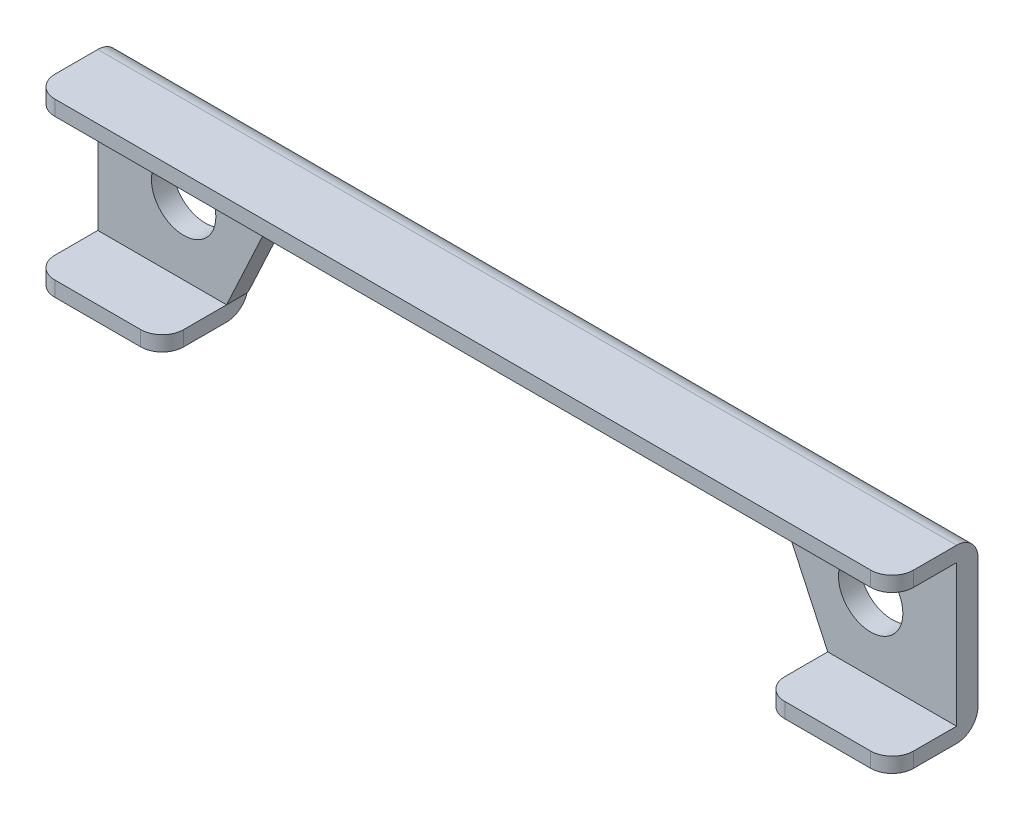
ISO-10303-21;
HEADER;
FILE_DESCRIPTION(('STEP AP214'),'2;1');
FILE_NAME('part.step','',(''),(''),'','','');
FILE_SCHEMA(('AUTOMOTIVE_DESIGN { 1 0 10303 214 1 1 1 1 }'));
ENDSEC;
DATA;
#1=APPLICATION_CONTEXT('core data for automotive mechanical design processes');
#2=APPLICATION_PROTOCOL_DEFINITION('international standard','automotive_design',2000,#1);
#3=PRODUCT_CONTEXT('',#1,'mechanical');
#4=PRODUCT('Part','Part','',(#3));
#5=PRODUCT_RELATED_PRODUCT_CATEGORY('part','',(#4));
#6=PRODUCT_DEFINITION_FORMATION('','',#4);
#7=PRODUCT_DEFINITION_CONTEXT('part definition',#1,'design');
#8=PRODUCT_DEFINITION('design','',#6,#7);
#9=PRODUCT_DEFINITION_SHAPE('','',#8);
#10=(LENGTH_UNIT() NAMED_UNIT(*) SI_UNIT(.MILLI.,.METRE.));
#11=(NAMED_UNIT(*) PLANE_ANGLE_UNIT() SI_UNIT($,.RADIAN.));
#12=(NAMED_UNIT(*) SI_UNIT($,.STERADIAN.) SOLID_ANGLE_UNIT());
#13=UNCERTAINTY_MEASURE_WITH_UNIT(LENGTH_MEASURE(1.E-05),#10,'distance_accuracy_value','');
#14=(GEOMETRIC_REPRESENTATION_CONTEXT(3) GLOBAL_UNCERTAINTY_ASSIGNED_CONTEXT((#13)) GLOBAL_UNIT_ASSIGNED_CONTEXT((#10,
#11,#12)) REPRESENTATION_CONTEXT('',''));
#15=CARTESIAN_POINT('',(0.,0.,0.));
#16=DIRECTION('',(0.,0.,1.));
#17=DIRECTION('',(1.,0.,0.));
#18=AXIS2_PLACEMENT_3D('',#15,#16,#17);
#19=CARTESIAN_POINT('',(-20.,-4.00000000000001,1.));
#20=DIRECTION('',(0.,1.,0.));
#21=DIRECTION('',(0.,0.,1.));
#22=AXIS2_PLACEMENT_3D('',#19,#20,#21);
#23=PLANE('',#22);
#24=DIRECTION('',(0.,0.,-1.));
#25=VECTOR('',#24,1.);
#26=CARTESIAN_POINT('',(20.,-4.,1.));
#27=LINE('',#26,#25);
#28=CARTESIAN_POINT('',(20.,-4.,3.));
#29=VERTEX_POINT('',#28);
#30=CARTESIAN_POINT('',(20.,-4.,1.));
#31=VERTEX_POINT('',#30);
#32=EDGE_CURVE('E269',#29,#31,#27,.T.);
#33=ORIENTED_EDGE('',*,*,#32,.F.);
#34=CARTESIAN_POINT('',(19.,-4.,3.));
#35=DIRECTION('',(0.,1.,0.));
#36=DIRECTION('',(0.,0.,1.));
#37=AXIS2_PLACEMENT_3D('',#34,#35,#36);
#38=CIRCLE('',#37,1.);
#39=CARTESIAN_POINT('',(19.,-4.,4.));
#40=VERTEX_POINT('',#39);
#41=EDGE_CURVE('E347',#29,#40,#38,.F.);
#42=ORIENTED_EDGE('',*,*,#41,.T.);
#43=DIRECTION('',(1.,0.,0.));
#44=VECTOR('',#43,1.);
#45=CARTESIAN_POINT('',(0.,-4.,4.));
#46=LINE('',#45,#44);
#47=CARTESIAN_POINT('',(15.,-4.00000000000001,4.));
#48=VERTEX_POINT('',#47);
#49=EDGE_CURVE('E407',#48,#40,#46,.T.);
#50=ORIENTED_EDGE('',*,*,#49,.F.);
#51=CARTESIAN_POINT('',(15.,-4.00000000000001,3.));
#52=DIRECTION('',(0.,1.,0.));
#53=DIRECTION('',(0.,0.,1.));
#54=AXIS2_PLACEMENT_3D('',#51,#52,#53);
#55=CIRCLE('',#54,1.);
#56=CARTESIAN_POINT('',(14.,-4.,3.));
#57=VERTEX_POINT('',#56);
#58=EDGE_CURVE('E345',#48,#57,#55,.F.);
#59=ORIENTED_EDGE('',*,*,#58,.T.);
#60=DIRECTION('',(0.,0.,-1.));
#61=VECTOR('',#60,1.);
#62=CARTESIAN_POINT('',(14.,-4.,4.));
#63=LINE('',#62,#61);
#64=CARTESIAN_POINT('',(14.,-4.,1.));
#65=VERTEX_POINT('',#64);
#66=EDGE_CURVE('E257',#57,#65,#63,.T.);
#67=ORIENTED_EDGE('',*,*,#66,.T.);
#68=DIRECTION('',(1.,0.,0.));
#69=VECTOR('',#68,1.);
#70=CARTESIAN_POINT('',(-20.,-4.00000000000001,1.));
#71=LINE('',#70,#69);
#72=EDGE_CURVE('E342',#65,#31,#71,.T.);
#73=ORIENTED_EDGE('',*,*,#72,.T.);
#74=EDGE_LOOP('',(#33,#42,#50,#59,#67,#73));
#75=FACE_BOUND('',#74,.T.);
#76=ADVANCED_FACE('F52',(#75),#23,.F.);
#77=CARTESIAN_POINT('',(0.,0.,1.));
#78=DIRECTION('',(0.,0.,1.));
#79=DIRECTION('',(1.,0.,0.));
#80=AXIS2_PLACEMENT_3D('',#77,#78,#79);
#81=PLANE('',#80);
#82=CARTESIAN_POINT('',(16.,0.,1.));
#83=DIRECTION('',(0.,0.,1.));
#84=DIRECTION('',(1.,0.,0.));
#85=AXIS2_PLACEMENT_3D('',#82,#83,#84);
#86=CIRCLE('',#85,1.5);
#87=CARTESIAN_POINT('',(17.5,0.,1.));
#88=VERTEX_POINT('',#87);
#89=EDGE_CURVE('E296',#88,#88,#86,.T.);
#90=ORIENTED_EDGE('',*,*,#89,.F.);
#91=EDGE_LOOP('',(#90));
#92=FACE_BOUND('',#91,.T.);
#93=CARTESIAN_POINT('',(-16.,0.,1.));
#94=DIRECTION('',(0.,0.,1.));
#95=DIRECTION('',(1.,0.,0.));
#96=AXIS2_PLACEMENT_3D('',#93,#94,#95);
#97=CIRCLE('',#96,1.5);
#98=CARTESIAN_POINT('',(-14.5,0.,1.));
#99=VERTEX_POINT('',#98);
#100=EDGE_CURVE('E443',#99,#99,#97,.T.);
#101=ORIENTED_EDGE('',*,*,#100,.F.);
#102=EDGE_LOOP('',(#101));
#103=FACE_BOUND('',#102,.T.);
#104=DIRECTION('',(-0.421730749715585,-0.906721111888507,0.));
#105=VECTOR('',#104,1.);
#106=CARTESIAN_POINT('',(-12.,1.,1.));
#107=LINE('',#106,#105);
#108=CARTESIAN_POINT('',(-12.,1.,1.));
#109=VERTEX_POINT('',#108);
#110=CARTESIAN_POINT('',(-14.,-3.30000000000004,1.));
#111=VERTEX_POINT('',#110);
#112=EDGE_CURVE('E235',#109,#111,#107,.T.);
#113=ORIENTED_EDGE('',*,*,#112,.F.);
#114=DIRECTION('',(-1.,0.,0.));
#115=VECTOR('',#114,1.);
#116=CARTESIAN_POINT('',(-12.,1.,1.));
#117=LINE('',#116,#115);
#118=CARTESIAN_POINT('',(12.,0.99999999999997,1.));
#119=VERTEX_POINT('',#118);
#120=EDGE_CURVE('E221',#119,#109,#117,.T.);
#121=ORIENTED_EDGE('',*,*,#120,.F.);
#122=DIRECTION('',(-0.421730749715584,0.906721111888507,0.));
#123=VECTOR('',#122,1.);
#124=CARTESIAN_POINT('',(14.,-3.3,1.));
#125=LINE('',#124,#123);
#126=CARTESIAN_POINT('',(14.,-3.3,1.));
#127=VERTEX_POINT('',#126);
#128=EDGE_CURVE('E242',#127,#119,#125,.T.);
#129=ORIENTED_EDGE('',*,*,#128,.F.);
#130=DIRECTION('',(1.,0.,0.));
#131=VECTOR('',#130,1.);
#132=CARTESIAN_POINT('',(0.,-3.3,1.));
#133=LINE('',#132,#131);
#134=CARTESIAN_POINT('',(20.,-3.30000000000001,1.));
#135=VERTEX_POINT('',#134);
#136=EDGE_CURVE('E417',#127,#135,#133,.T.);
#137=ORIENTED_EDGE('',*,*,#136,.T.);
#138=DIRECTION('',(0.,1.,0.));
#139=VECTOR('',#138,1.);
#140=CARTESIAN_POINT('',(20.,4.,1.));
#141=LINE('',#140,#139);
#142=CARTESIAN_POINT('',(20.,3.29999999999998,1.));
#143=VERTEX_POINT('',#142);
#144=EDGE_CURVE('E264',#135,#143,#141,.T.);
#145=ORIENTED_EDGE('',*,*,#144,.T.);
#146=DIRECTION('',(1.,0.,0.));
#147=VECTOR('',#146,1.);
#148=CARTESIAN_POINT('',(-20.,3.3,1.));
#149=LINE('',#148,#147);
#150=CARTESIAN_POINT('',(-20.,3.3,1.));
#151=VERTEX_POINT('',#150);
#152=EDGE_CURVE('E432',#151,#143,#149,.T.);
#153=ORIENTED_EDGE('',*,*,#152,.F.);
#154=DIRECTION('',(0.,-1.,0.));
#155=VECTOR('',#154,1.);
#156=CARTESIAN_POINT('',(-20.,4.,1.));
#157=LINE('',#156,#155);
#158=CARTESIAN_POINT('',(-20.,-3.3,1.));
#159=VERTEX_POINT('',#158);
#160=EDGE_CURVE('E249',#151,#159,#157,.T.);
#161=ORIENTED_EDGE('',*,*,#160,.T.);
#162=DIRECTION('',(-1.,0.,0.));
#163=VECTOR('',#162,1.);
#164=CARTESIAN_POINT('',(0.,-3.3,1.));
#165=LINE('',#164,#163);
#166=EDGE_CURVE('E229',#111,#159,#165,.T.);
#167=ORIENTED_EDGE('',*,*,#166,.F.);
#168=EDGE_LOOP('',(#113,#121,#129,#137,#145,#153,#161,#167));
#169=FACE_BOUND('',#168,.T.);
#170=ADVANCED_FACE('F246',(#92,#103,#169),#81,.T.);
#171=CARTESIAN_POINT('',(20.,4.,1.));
#172=DIRECTION('',(-1.,0.,0.));
#173=DIRECTION('',(0.,0.,1.));
#174=AXIS2_PLACEMENT_3D('',#171,#172,#173);
#175=PLANE('',#174);
#176=DIRECTION('',(0.,0.,-1.));
#177=VECTOR('',#176,1.);
#178=CARTESIAN_POINT('',(20.,-3.30000000000001,4.));
#179=LINE('',#178,#177);
#180=CARTESIAN_POINT('',(20.,-3.30000000000001,3.));
#181=VERTEX_POINT('',#180);
#182=EDGE_CURVE('E401',#181,#135,#179,.T.);
#183=ORIENTED_EDGE('',*,*,#182,.F.);
#184=DIRECTION('',(0.,1.,0.));
#185=VECTOR('',#184,1.);
#186=CARTESIAN_POINT('',(20.,-4.,3.));
#187=LINE('',#186,#185);
#188=EDGE_CURVE('E340',#181,#29,#187,.F.);
#189=ORIENTED_EDGE('',*,*,#188,.T.);
#190=ORIENTED_EDGE('',*,*,#32,.T.);
#191=CARTESIAN_POINT('',(20.,-3.00000000000002,1.));
#192=DIRECTION('',(-1.,0.,0.));
#193=DIRECTION('',(0.,0.,1.));
#194=AXIS2_PLACEMENT_3D('',#191,#192,#193);
#195=CIRCLE('',#194,1.);
#196=CARTESIAN_POINT('',(20.,-3.00000000000002,0.));
#197=VERTEX_POINT('',#196);
#198=EDGE_CURVE('E336',#31,#197,#195,.F.);
#199=ORIENTED_EDGE('',*,*,#198,.T.);
#200=DIRECTION('',(0.,1.,0.));
#201=VECTOR('',#200,1.);
#202=CARTESIAN_POINT('',(20.,4.,0.));
#203=LINE('',#202,#201);
#204=CARTESIAN_POINT('',(20.,2.99999999999999,0.));
#205=VERTEX_POINT('',#204);
#206=EDGE_CURVE('E231',#197,#205,#203,.T.);
#207=ORIENTED_EDGE('',*,*,#206,.T.);
#208=CARTESIAN_POINT('',(20.,2.99999999999999,1.));
#209=DIRECTION('',(-1.,0.,0.));
#210=DIRECTION('',(0.,0.,1.));
#211=AXIS2_PLACEMENT_3D('',#208,#209,#210);
#212=CIRCLE('',#211,1.);
#213=CARTESIAN_POINT('',(20.,4.,1.));
#214=VERTEX_POINT('',#213);
#215=EDGE_CURVE('E334',#205,#214,#212,.F.);
#216=ORIENTED_EDGE('',*,*,#215,.T.);
#217=DIRECTION('',(0.,0.,-1.));
#218=VECTOR('',#217,1.);
#219=CARTESIAN_POINT('',(20.,4.,1.));
#220=LINE('',#219,#218);
#221=CARTESIAN_POINT('',(20.,4.,3.));
#222=VERTEX_POINT('',#221);
#223=EDGE_CURVE('E282',#222,#214,#220,.T.);
#224=ORIENTED_EDGE('',*,*,#223,.F.);
#225=DIRECTION('',(0.,1.,0.));
#226=VECTOR('',#225,1.);
#227=CARTESIAN_POINT('',(20.,3.29999999999998,3.));
#228=LINE('',#227,#226);
#229=CARTESIAN_POINT('',(20.,3.29999999999998,3.));
#230=VERTEX_POINT('',#229);
#231=EDGE_CURVE('E338',#222,#230,#228,.F.);
#232=ORIENTED_EDGE('',*,*,#231,.T.);
#233=DIRECTION('',(0.,0.,-1.));
#234=VECTOR('',#233,1.);
#235=CARTESIAN_POINT('',(20.,3.29999999999998,4.));
#236=LINE('',#235,#234);
#237=EDGE_CURVE('E425',#230,#143,#236,.T.);
#238=ORIENTED_EDGE('',*,*,#237,.T.);
#239=ORIENTED_EDGE('',*,*,#144,.F.);
#240=EDGE_LOOP('',(#183,#189,#190,#199,#207,#216,#224,#232,#238,#239));
#241=FACE_BOUND('',#240,.T.);
#242=ADVANCED_FACE('F398',(#241),#175,.F.);
#243=CARTESIAN_POINT('',(-20.,4.,1.));
#244=DIRECTION('',(0.,-1.,0.));
#245=DIRECTION('',(0.,0.,-1.));
#246=AXIS2_PLACEMENT_3D('',#243,#244,#245);
#247=PLANE('',#246);
#248=DIRECTION('',(-1.,0.,0.));
#249=VECTOR('',#248,1.);
#250=CARTESIAN_POINT('',(-20.,4.,4.));
#251=LINE('',#250,#249);
#252=CARTESIAN_POINT('',(19.,4.,4.));
#253=VERTEX_POINT('',#252);
#254=CARTESIAN_POINT('',(-19.,3.99999999999999,4.));
#255=VERTEX_POINT('',#254);
#256=EDGE_CURVE('E429',#253,#255,#251,.T.);
#257=ORIENTED_EDGE('',*,*,#256,.F.);
#258=CARTESIAN_POINT('',(19.,4.,3.));
#259=DIRECTION('',(0.,-1.,0.));
#260=DIRECTION('',(0.,0.,-1.));
#261=AXIS2_PLACEMENT_3D('',#258,#259,#260);
#262=CIRCLE('',#261,1.);
#263=EDGE_CURVE('E365',#253,#222,#262,.F.);
#264=ORIENTED_EDGE('',*,*,#263,.T.);
#265=ORIENTED_EDGE('',*,*,#223,.T.);
#266=DIRECTION('',(-1.,0.,0.));
#267=VECTOR('',#266,1.);
#268=CARTESIAN_POINT('',(-20.,4.,1.));
#269=LINE('',#268,#267);
#270=CARTESIAN_POINT('',(-20.,4.,1.));
#271=VERTEX_POINT('',#270);
#272=EDGE_CURVE('E360',#214,#271,#269,.T.);
#273=ORIENTED_EDGE('',*,*,#272,.T.);
#274=DIRECTION('',(0.,0.,-1.));
#275=VECTOR('',#274,1.);
#276=CARTESIAN_POINT('',(-20.,4.,1.));
#277=LINE('',#276,#275);
#278=CARTESIAN_POINT('',(-20.,4.,3.));
#279=VERTEX_POINT('',#278);
#280=EDGE_CURVE('E279',#279,#271,#277,.T.);
#281=ORIENTED_EDGE('',*,*,#280,.F.);
#282=CARTESIAN_POINT('',(-19.,3.99999999999999,3.));
#283=DIRECTION('',(0.,-1.,0.));
#284=DIRECTION('',(0.,0.,-1.));
#285=AXIS2_PLACEMENT_3D('',#282,#283,#284);
#286=CIRCLE('',#285,1.);
#287=EDGE_CURVE('E363',#279,#255,#286,.F.);
#288=ORIENTED_EDGE('',*,*,#287,.T.);
#289=EDGE_LOOP('',(#257,#264,#265,#273,#281,#288));
#290=FACE_BOUND('',#289,.T.);
#291=ADVANCED_FACE('F477',(#290),#247,.F.);
#292=CARTESIAN_POINT('',(-20.,4.,1.));
#293=DIRECTION('',(1.,0.,0.));
#294=DIRECTION('',(0.,0.,-1.));
#295=AXIS2_PLACEMENT_3D('',#292,#293,#294);
#296=PLANE('',#295);
#297=DIRECTION('',(0.,0.,-1.));
#298=VECTOR('',#297,1.);
#299=CARTESIAN_POINT('',(-20.,-4.00000000000001,1.));
#300=LINE('',#299,#298);
#301=CARTESIAN_POINT('',(-20.,-4.00000000000001,3.));
#302=VERTEX_POINT('',#301);
#303=CARTESIAN_POINT('',(-20.,-4.00000000000001,1.));
#304=VERTEX_POINT('',#303);
#305=EDGE_CURVE('E276',#302,#304,#300,.T.);
#306=ORIENTED_EDGE('',*,*,#305,.F.);
#307=DIRECTION('',(0.,-1.,0.));
#308=VECTOR('',#307,1.);
#309=CARTESIAN_POINT('',(-20.,-3.3,3.));
#310=LINE('',#309,#308);
#311=CARTESIAN_POINT('',(-20.,-3.3,3.));
#312=VERTEX_POINT('',#311);
#313=EDGE_CURVE('E323',#302,#312,#310,.F.);
#314=ORIENTED_EDGE('',*,*,#313,.T.);
#315=DIRECTION('',(0.,0.,-1.));
#316=VECTOR('',#315,1.);
#317=CARTESIAN_POINT('',(-20.,-3.3,4.));
#318=LINE('',#317,#316);
#319=EDGE_CURVE('E232',#312,#159,#318,.T.);
#320=ORIENTED_EDGE('',*,*,#319,.T.);
#321=ORIENTED_EDGE('',*,*,#160,.F.);
#322=DIRECTION('',(0.,0.,-1.));
#323=VECTOR('',#322,1.);
#324=CARTESIAN_POINT('',(-20.,3.3,4.));
#325=LINE('',#324,#323);
#326=CARTESIAN_POINT('',(-20.,3.3,3.));
#327=VERTEX_POINT('',#326);
#328=EDGE_CURVE('E422',#327,#151,#325,.T.);
#329=ORIENTED_EDGE('',*,*,#328,.F.);
#330=DIRECTION('',(0.,-1.,0.));
#331=VECTOR('',#330,1.);
#332=CARTESIAN_POINT('',(-20.,4.,3.));
#333=LINE('',#332,#331);
#334=EDGE_CURVE('E321',#327,#279,#333,.F.);
#335=ORIENTED_EDGE('',*,*,#334,.T.);
#336=ORIENTED_EDGE('',*,*,#280,.T.);
#337=CARTESIAN_POINT('',(-20.,3.,1.));
#338=DIRECTION('',(1.,0.,0.));
#339=DIRECTION('',(0.,0.,-1.));
#340=AXIS2_PLACEMENT_3D('',#337,#338,#339);
#341=CIRCLE('',#340,1.);
#342=CARTESIAN_POINT('',(-20.,3.,0.));
#343=VERTEX_POINT('',#342);
#344=EDGE_CURVE('E317',#271,#343,#341,.F.);
#345=ORIENTED_EDGE('',*,*,#344,.T.);
#346=DIRECTION('',(0.,-1.,0.));
#347=VECTOR('',#346,1.);
#348=CARTESIAN_POINT('',(-20.,4.,0.));
#349=LINE('',#348,#347);
#350=CARTESIAN_POINT('',(-20.,-3.,0.));
#351=VERTEX_POINT('',#350);
#352=EDGE_CURVE('E267',#343,#351,#349,.T.);
#353=ORIENTED_EDGE('',*,*,#352,.T.);
#354=CARTESIAN_POINT('',(-20.,-3.,1.));
#355=DIRECTION('',(1.,0.,0.));
#356=DIRECTION('',(0.,0.,-1.));
#357=AXIS2_PLACEMENT_3D('',#354,#355,#356);
#358=CIRCLE('',#357,1.);
#359=EDGE_CURVE('E319',#351,#304,#358,.F.);
#360=ORIENTED_EDGE('',*,*,#359,.T.);
#361=EDGE_LOOP('',(#306,#314,#320,#321,#329,#335,#336,#345,#353,#360));
#362=FACE_BOUND('',#361,.T.);
#363=ADVANCED_FACE('F481',(#362),#296,.F.);
#364=DIRECTION('',(0.,0.,-1.));
#365=VECTOR('',#364,1.);
#366=CARTESIAN_POINT('',(-14.,-4.00000000000003,4.));
#367=LINE('',#366,#365);
#368=CARTESIAN_POINT('',(-14.,-4.00000000000003,3.));
#369=VERTEX_POINT('',#368);
#370=CARTESIAN_POINT('',(-14.,-4.00000000000003,1.));
#371=VERTEX_POINT('',#370);
#372=EDGE_CURVE('E261',#369,#371,#367,.T.);
#373=ORIENTED_EDGE('',*,*,#372,.F.);
#374=CARTESIAN_POINT('',(-15.,-4.,3.));
#375=DIRECTION('',(0.,1.,0.));
#376=DIRECTION('',(0.,0.,1.));
#377=AXIS2_PLACEMENT_3D('',#374,#375,#376);
#378=CIRCLE('',#377,1.);
#379=CARTESIAN_POINT('',(-15.,-4.,4.));
#380=VERTEX_POINT('',#379);
#381=EDGE_CURVE('E315',#369,#380,#378,.F.);
#382=ORIENTED_EDGE('',*,*,#381,.T.);
#383=DIRECTION('',(1.,0.,0.));
#384=VECTOR('',#383,1.);
#385=CARTESIAN_POINT('',(0.,-4.,4.));
#386=LINE('',#385,#384);
#387=CARTESIAN_POINT('',(-19.,-4.00000000000002,4.));
#388=VERTEX_POINT('',#387);
#389=EDGE_CURVE('E254',#388,#380,#386,.T.);
#390=ORIENTED_EDGE('',*,*,#389,.F.);
#391=CARTESIAN_POINT('',(-19.,-4.00000000000002,3.));
#392=DIRECTION('',(0.,1.,0.));
#393=DIRECTION('',(0.,0.,1.));
#394=AXIS2_PLACEMENT_3D('',#391,#392,#393);
#395=CIRCLE('',#394,1.);
#396=EDGE_CURVE('E313',#388,#302,#395,.F.);
#397=ORIENTED_EDGE('',*,*,#396,.T.);
#398=ORIENTED_EDGE('',*,*,#305,.T.);
#399=DIRECTION('',(1.,0.,0.));
#400=VECTOR('',#399,1.);
#401=CARTESIAN_POINT('',(-20.,-4.00000000000001,1.));
#402=LINE('',#401,#400);
#403=EDGE_CURVE('E310',#304,#371,#402,.T.);
#404=ORIENTED_EDGE('',*,*,#403,.T.);
#405=EDGE_LOOP('',(#373,#382,#390,#397,#398,#404));
#406=FACE_BOUND('',#405,.T.);
#407=ADVANCED_FACE('F465',(#406),#23,.F.);
#408=CARTESIAN_POINT('',(0.,0.,0.));
#409=DIRECTION('',(0.,0.,1.));
#410=DIRECTION('',(1.,0.,0.));
#411=AXIS2_PLACEMENT_3D('',#408,#409,#410);
#412=PLANE('',#411);
#413=CARTESIAN_POINT('',(16.,0.,0.));
#414=DIRECTION('',(0.,0.,1.));
#415=DIRECTION('',(1.,0.,0.));
#416=AXIS2_PLACEMENT_3D('',#413,#414,#415);
#417=CIRCLE('',#416,1.5);
#418=CARTESIAN_POINT('',(17.5,0.,0.));
#419=VERTEX_POINT('',#418);
#420=EDGE_CURVE('E243',#419,#419,#417,.T.);
#421=ORIENTED_EDGE('',*,*,#420,.T.);
#422=EDGE_LOOP('',(#421));
#423=FACE_BOUND('',#422,.T.);
#424=CARTESIAN_POINT('',(-16.,0.,0.));
#425=DIRECTION('',(0.,0.,1.));
#426=DIRECTION('',(1.,0.,0.));
#427=AXIS2_PLACEMENT_3D('',#424,#425,#426);
#428=CIRCLE('',#427,1.5);
#429=CARTESIAN_POINT('',(-14.5,0.,0.));
#430=VERTEX_POINT('',#429);
#431=EDGE_CURVE('E293',#430,#430,#428,.T.);
#432=ORIENTED_EDGE('',*,*,#431,.T.);
#433=EDGE_LOOP('',(#432));
#434=FACE_BOUND('',#433,.T.);
#435=ORIENTED_EDGE('',*,*,#206,.F.);
#436=DIRECTION('',(1.,0.,0.));
#437=VECTOR('',#436,1.);
#438=CARTESIAN_POINT('',(0.,-3.,0.));
#439=LINE('',#438,#437);
#440=CARTESIAN_POINT('',(13.8604651162791,-3.,0.));
#441=VERTEX_POINT('',#440);
#442=EDGE_CURVE('E73',#197,#441,#439,.F.);
#443=ORIENTED_EDGE('',*,*,#442,.T.);
#444=DIRECTION('',(-0.421730749715584,0.906721111888507,0.));
#445=VECTOR('',#444,1.);
#446=CARTESIAN_POINT('',(10.2481102712316,4.76656291685193,0.));
#447=LINE('',#446,#445);
#448=CARTESIAN_POINT('',(12.,0.99999999999997,0.));
#449=VERTEX_POINT('',#448);
#450=EDGE_CURVE('E290',#441,#449,#447,.T.);
#451=ORIENTED_EDGE('',*,*,#450,.T.);
#452=DIRECTION('',(-1.,0.,0.));
#453=VECTOR('',#452,1.);
#454=CARTESIAN_POINT('',(0.,1.,0.));
#455=LINE('',#454,#453);
#456=CARTESIAN_POINT('',(-12.,1.,0.));
#457=VERTEX_POINT('',#456);
#458=EDGE_CURVE('E287',#449,#457,#455,.T.);
#459=ORIENTED_EDGE('',*,*,#458,.T.);
#460=DIRECTION('',(-0.421730749715585,-0.906721111888507,0.));
#461=VECTOR('',#460,1.);
#462=CARTESIAN_POINT('',(-10.2481102712317,4.76656291685193,0.));
#463=LINE('',#462,#461);
#464=CARTESIAN_POINT('',(-13.8604651162791,-3.00000000000009,0.));
#465=VERTEX_POINT('',#464);
#466=EDGE_CURVE('E285',#457,#465,#463,.T.);
#467=ORIENTED_EDGE('',*,*,#466,.T.);
#468=DIRECTION('',(1.,0.,0.));
#469=VECTOR('',#468,1.);
#470=CARTESIAN_POINT('',(0.,-3.,0.));
#471=LINE('',#470,#469);
#472=EDGE_CURVE('E373',#465,#351,#471,.F.);
#473=ORIENTED_EDGE('',*,*,#472,.T.);
#474=ORIENTED_EDGE('',*,*,#352,.F.);
#475=DIRECTION('',(-1.,0.,0.));
#476=VECTOR('',#475,1.);
#477=CARTESIAN_POINT('',(0.,3.,0.));
#478=LINE('',#477,#476);
#479=EDGE_CURVE('E371',#343,#205,#478,.F.);
#480=ORIENTED_EDGE('',*,*,#479,.T.);
#481=EDGE_LOOP('',(#435,#443,#451,#459,#467,#473,#474,#480));
#482=FACE_BOUND('',#481,.T.);
#483=ADVANCED_FACE('F463',(#423,#434,#482),#412,.F.);
#484=CARTESIAN_POINT('',(-14.,0.,4.));
#485=DIRECTION('',(-1.,0.,0.));
#486=DIRECTION('',(0.,0.,1.));
#487=AXIS2_PLACEMENT_3D('',#484,#485,#486);
#488=PLANE('',#487);
#489=DIRECTION('',(0.,0.,-1.));
#490=VECTOR('',#489,1.);
#491=CARTESIAN_POINT('',(-14.,-3.30000000000004,4.));
#492=LINE('',#491,#490);
#493=CARTESIAN_POINT('',(-14.,-3.30000000000004,3.));
#494=VERTEX_POINT('',#493);
#495=EDGE_CURVE('E215',#494,#111,#492,.T.);
#496=ORIENTED_EDGE('',*,*,#495,.F.);
#497=DIRECTION('',(0.,1.,0.));
#498=VECTOR('',#497,1.);
#499=CARTESIAN_POINT('',(-14.,-4.00000000000003,3.));
#500=LINE('',#499,#498);
#501=EDGE_CURVE('E308',#494,#369,#500,.F.);
#502=ORIENTED_EDGE('',*,*,#501,.T.);
#503=ORIENTED_EDGE('',*,*,#372,.T.);
#504=CARTESIAN_POINT('',(-14.,-3.00000000000003,1.));
#505=DIRECTION('',(-1.,0.,0.));
#506=DIRECTION('',(0.,0.,1.));
#507=AXIS2_PLACEMENT_3D('',#504,#505,#506);
#508=CIRCLE('',#507,1.);
#509=CARTESIAN_POINT('',(-14.,-3.30000000000004,0.0460607985830544));
#510=VERTEX_POINT('',#509);
#511=EDGE_CURVE('E218',#371,#510,#508,.F.);
#512=ORIENTED_EDGE('',*,*,#511,.T.);
#513=DIRECTION('',(0.,0.,1.));
#514=VECTOR('',#513,1.);
#515=CARTESIAN_POINT('',(-14.,-3.30000000000004,-2.));
#516=LINE('',#515,#514);
#517=EDGE_CURVE('E212',#510,#111,#516,.T.);
#518=ORIENTED_EDGE('',*,*,#517,.T.);
#519=EDGE_LOOP('',(#496,#502,#503,#512,#518));
#520=FACE_BOUND('',#519,.T.);
#521=ADVANCED_FACE('F214',(#520),#488,.F.);
#522=CARTESIAN_POINT('',(0.,-3.3,4.));
#523=DIRECTION('',(0.,-1.,0.));
#524=DIRECTION('',(0.,0.,-1.));
#525=AXIS2_PLACEMENT_3D('',#522,#523,#524);
#526=PLANE('',#525);
#527=DIRECTION('',(-1.,0.,0.));
#528=VECTOR('',#527,1.);
#529=CARTESIAN_POINT('',(0.,-3.3,4.));
#530=LINE('',#529,#528);
#531=CARTESIAN_POINT('',(-15.,-3.30000000000001,4.));
#532=VERTEX_POINT('',#531);
#533=CARTESIAN_POINT('',(-19.,-3.30000000000001,4.));
#534=VERTEX_POINT('',#533);
#535=EDGE_CURVE('E250',#532,#534,#530,.T.);
#536=ORIENTED_EDGE('',*,*,#535,.F.);
#537=CARTESIAN_POINT('',(-15.,-3.30000000000001,3.));
#538=DIRECTION('',(0.,-1.,0.));
#539=DIRECTION('',(0.,0.,-1.));
#540=AXIS2_PLACEMENT_3D('',#537,#538,#539);
#541=CIRCLE('',#540,1.);
#542=EDGE_CURVE('E230',#532,#494,#541,.F.);
#543=ORIENTED_EDGE('',*,*,#542,.T.);
#544=ORIENTED_EDGE('',*,*,#495,.T.);
#545=ORIENTED_EDGE('',*,*,#166,.T.);
#546=ORIENTED_EDGE('',*,*,#319,.F.);
#547=CARTESIAN_POINT('',(-19.,-3.30000000000001,3.));
#548=DIRECTION('',(0.,-1.,0.));
#549=DIRECTION('',(0.,0.,-1.));
#550=AXIS2_PLACEMENT_3D('',#547,#548,#549);
#551=CIRCLE('',#550,1.);
#552=EDGE_CURVE('E304',#312,#534,#551,.F.);
#553=ORIENTED_EDGE('',*,*,#552,.T.);
#554=EDGE_LOOP('',(#536,#543,#544,#545,#546,#553));
#555=FACE_BOUND('',#554,.T.);
#556=ADVANCED_FACE('F226',(#555),#526,.F.);
#557=CARTESIAN_POINT('',(0.,0.,4.));
#558=DIRECTION('',(0.,0.,1.));
#559=DIRECTION('',(1.,0.,0.));
#560=AXIS2_PLACEMENT_3D('',#557,#558,#559);
#561=PLANE('',#560);
#562=ORIENTED_EDGE('',*,*,#389,.T.);
#563=DIRECTION('',(0.,1.,0.));
#564=VECTOR('',#563,1.);
#565=CARTESIAN_POINT('',(-15.,-3.30000000000001,4.));
#566=LINE('',#565,#564);
#567=EDGE_CURVE('E301',#380,#532,#566,.T.);
#568=ORIENTED_EDGE('',*,*,#567,.T.);
#569=ORIENTED_EDGE('',*,*,#535,.T.);
#570=DIRECTION('',(0.,-1.,0.));
#571=VECTOR('',#570,1.);
#572=CARTESIAN_POINT('',(-19.,-4.00000000000002,4.));
#573=LINE('',#572,#571);
#574=EDGE_CURVE('E292',#534,#388,#573,.T.);
#575=ORIENTED_EDGE('',*,*,#574,.T.);
#576=EDGE_LOOP('',(#562,#568,#569,#575));
#577=FACE_BOUND('',#576,.T.);
#578=ADVANCED_FACE('F504',(#577),#561,.T.);
#579=CARTESIAN_POINT('',(0.,-3.3,4.));
#580=DIRECTION('',(0.,1.,0.));
#581=DIRECTION('',(-1.,0.,0.));
#582=AXIS2_PLACEMENT_3D('',#579,#580,#581);
#583=PLANE('',#582);
#584=DIRECTION('',(1.,0.,0.));
#585=VECTOR('',#584,1.);
#586=CARTESIAN_POINT('',(0.,-3.3,4.));
#587=LINE('',#586,#585);
#588=CARTESIAN_POINT('',(15.,-3.3,4.));
#589=VERTEX_POINT('',#588);
#590=CARTESIAN_POINT('',(19.,-3.3,4.));
#591=VERTEX_POINT('',#590);
#592=EDGE_CURVE('E414',#589,#591,#587,.T.);
#593=ORIENTED_EDGE('',*,*,#592,.T.);
#594=CARTESIAN_POINT('',(19.,-3.3,3.));
#595=DIRECTION('',(0.,1.,0.));
#596=DIRECTION('',(-1.,0.,0.));
#597=AXIS2_PLACEMENT_3D('',#594,#595,#596);
#598=CIRCLE('',#597,1.);
#599=EDGE_CURVE('E332',#591,#181,#598,.T.);
#600=ORIENTED_EDGE('',*,*,#599,.T.);
#601=ORIENTED_EDGE('',*,*,#182,.T.);
#602=ORIENTED_EDGE('',*,*,#136,.F.);
#603=DIRECTION('',(0.,0.,-1.));
#604=VECTOR('',#603,1.);
#605=CARTESIAN_POINT('',(14.,-3.3,4.));
#606=LINE('',#605,#604);
#607=CARTESIAN_POINT('',(14.,-3.3,3.));
#608=VERTEX_POINT('',#607);
#609=EDGE_CURVE('E251',#608,#127,#606,.T.);
#610=ORIENTED_EDGE('',*,*,#609,.F.);
#611=CARTESIAN_POINT('',(15.,-3.3,3.));
#612=DIRECTION('',(0.,1.,0.));
#613=DIRECTION('',(-1.,0.,0.));
#614=AXIS2_PLACEMENT_3D('',#611,#612,#613);
#615=CIRCLE('',#614,1.);
#616=EDGE_CURVE('E330',#608,#589,#615,.T.);
#617=ORIENTED_EDGE('',*,*,#616,.T.);
#618=EDGE_LOOP('',(#593,#600,#601,#602,#610,#617));
#619=FACE_BOUND('',#618,.T.);
#620=ADVANCED_FACE('F561',(#619),#583,.T.);
#621=CARTESIAN_POINT('',(14.,0.,4.));
#622=DIRECTION('',(-1.,0.,0.));
#623=DIRECTION('',(0.,-1.,0.));
#624=AXIS2_PLACEMENT_3D('',#621,#622,#623);
#625=PLANE('',#624);
#626=ORIENTED_EDGE('',*,*,#66,.F.);
#627=DIRECTION('',(0.,1.,0.));
#628=VECTOR('',#627,1.);
#629=CARTESIAN_POINT('',(14.,0.,3.));
#630=LINE('',#629,#628);
#631=EDGE_CURVE('E351',#57,#608,#630,.T.);
#632=ORIENTED_EDGE('',*,*,#631,.T.);
#633=ORIENTED_EDGE('',*,*,#609,.T.);
#634=DIRECTION('',(0.,0.,1.));
#635=VECTOR('',#634,1.);
#636=CARTESIAN_POINT('',(14.,-3.3,-2.));
#637=LINE('',#636,#635);
#638=CARTESIAN_POINT('',(14.,-3.3,0.0460607985830544));
#639=VERTEX_POINT('',#638);
#640=EDGE_CURVE('E220',#639,#127,#637,.T.);
#641=ORIENTED_EDGE('',*,*,#640,.F.);
#642=CARTESIAN_POINT('',(14.,-3.,1.));
#643=DIRECTION('',(-1.,0.,0.));
#644=DIRECTION('',(0.,-1.,0.));
#645=AXIS2_PLACEMENT_3D('',#642,#643,#644);
#646=CIRCLE('',#645,1.);
#647=EDGE_CURVE('E349',#639,#65,#646,.T.);
#648=ORIENTED_EDGE('',*,*,#647,.T.);
#649=EDGE_LOOP('',(#626,#632,#633,#641,#648));
#650=FACE_BOUND('',#649,.T.);
#651=ADVANCED_FACE('F385',(#650),#625,.T.);
#652=CARTESIAN_POINT('',(0.,0.,4.));
#653=DIRECTION('',(0.,0.,1.));
#654=DIRECTION('',(1.,0.,0.));
#655=AXIS2_PLACEMENT_3D('',#652,#653,#654);
#656=PLANE('',#655);
#657=ORIENTED_EDGE('',*,*,#49,.T.);
#658=DIRECTION('',(0.,1.,0.));
#659=VECTOR('',#658,1.);
#660=CARTESIAN_POINT('',(19.,-3.3,4.));
#661=LINE('',#660,#659);
#662=EDGE_CURVE('E327',#40,#591,#661,.T.);
#663=ORIENTED_EDGE('',*,*,#662,.T.);
#664=ORIENTED_EDGE('',*,*,#592,.F.);
#665=DIRECTION('',(0.,1.,0.));
#666=VECTOR('',#665,1.);
#667=CARTESIAN_POINT('',(15.,0.,4.));
#668=LINE('',#667,#666);
#669=EDGE_CURVE('E325',#589,#48,#668,.F.);
#670=ORIENTED_EDGE('',*,*,#669,.T.);
#671=EDGE_LOOP('',(#657,#663,#664,#670));
#672=FACE_BOUND('',#671,.T.);
#673=ADVANCED_FACE('F410',(#672),#656,.T.);
#674=CARTESIAN_POINT('',(-20.,3.3,4.));
#675=DIRECTION('',(0.,1.,0.));
#676=DIRECTION('',(0.,0.,1.));
#677=AXIS2_PLACEMENT_3D('',#674,#675,#676);
#678=PLANE('',#677);
#679=ORIENTED_EDGE('',*,*,#237,.F.);
#680=CARTESIAN_POINT('',(19.,3.3,3.));
#681=DIRECTION('',(0.,1.,0.));
#682=DIRECTION('',(0.,0.,1.));
#683=AXIS2_PLACEMENT_3D('',#680,#681,#682);
#684=CIRCLE('',#683,1.);
#685=CARTESIAN_POINT('',(19.,3.3,4.));
#686=VERTEX_POINT('',#685);
#687=EDGE_CURVE('E369',#230,#686,#684,.F.);
#688=ORIENTED_EDGE('',*,*,#687,.T.);
#689=DIRECTION('',(1.,0.,0.));
#690=VECTOR('',#689,1.);
#691=CARTESIAN_POINT('',(-20.,3.3,4.));
#692=LINE('',#691,#690);
#693=CARTESIAN_POINT('',(-19.,3.29999999999998,4.));
#694=VERTEX_POINT('',#693);
#695=EDGE_CURVE('E434',#694,#686,#692,.T.);
#696=ORIENTED_EDGE('',*,*,#695,.F.);
#697=CARTESIAN_POINT('',(-19.,3.29999999999998,3.));
#698=DIRECTION('',(0.,1.,0.));
#699=DIRECTION('',(0.,0.,1.));
#700=AXIS2_PLACEMENT_3D('',#697,#698,#699);
#701=CIRCLE('',#700,1.);
#702=EDGE_CURVE('E367',#694,#327,#701,.F.);
#703=ORIENTED_EDGE('',*,*,#702,.T.);
#704=ORIENTED_EDGE('',*,*,#328,.T.);
#705=ORIENTED_EDGE('',*,*,#152,.T.);
#706=EDGE_LOOP('',(#679,#688,#696,#703,#704,#705));
#707=FACE_BOUND('',#706,.T.);
#708=ADVANCED_FACE('F495',(#707),#678,.F.);
#709=CARTESIAN_POINT('',(0.,0.,4.));
#710=DIRECTION('',(0.,0.,1.));
#711=DIRECTION('',(1.,0.,0.));
#712=AXIS2_PLACEMENT_3D('',#709,#710,#711);
#713=PLANE('',#712);
#714=ORIENTED_EDGE('',*,*,#695,.T.);
#715=DIRECTION('',(0.,1.,0.));
#716=VECTOR('',#715,1.);
#717=CARTESIAN_POINT('',(19.,4.,4.));
#718=LINE('',#717,#716);
#719=EDGE_CURVE('E357',#686,#253,#718,.T.);
#720=ORIENTED_EDGE('',*,*,#719,.T.);
#721=ORIENTED_EDGE('',*,*,#256,.T.);
#722=DIRECTION('',(0.,-1.,0.));
#723=VECTOR('',#722,1.);
#724=CARTESIAN_POINT('',(-19.,3.29999999999998,4.));
#725=LINE('',#724,#723);
#726=EDGE_CURVE('E354',#255,#694,#725,.T.);
#727=ORIENTED_EDGE('',*,*,#726,.T.);
#728=EDGE_LOOP('',(#714,#720,#721,#727));
#729=FACE_BOUND('',#728,.T.);
#730=ADVANCED_FACE('F487',(#729),#713,.T.);
#731=CARTESIAN_POINT('',(-12.,1.,-2.));
#732=DIRECTION('',(-0.906721111888507,0.421730749715585,0.));
#733=DIRECTION('',(-0.421730749715585,-0.906721111888507,0.));
#734=AXIS2_PLACEMENT_3D('',#731,#732,#733);
#735=PLANE('',#734);
#736=ORIENTED_EDGE('',*,*,#517,.F.);
#737=CARTESIAN_POINT('',(-13.8604651162791,-3.00000000000009,1.));
#738=DIRECTION('',(-0.906721111888507,0.421730749715585,0.));
#739=DIRECTION('',(0.421730749715585,0.906721111888507,0.));
#740=AXIS2_PLACEMENT_3D('',#737,#738,#739);
#741=ELLIPSE('',#740,1.10287494896552,1.);
#742=EDGE_CURVE('E13',#510,#465,#741,.F.);
#743=ORIENTED_EDGE('',*,*,#742,.T.);
#744=ORIENTED_EDGE('',*,*,#466,.F.);
#745=DIRECTION('',(0.,0.,1.));
#746=VECTOR('',#745,1.);
#747=CARTESIAN_POINT('',(-12.,1.,-2.));
#748=LINE('',#747,#746);
#749=EDGE_CURVE('E238',#457,#109,#748,.T.);
#750=ORIENTED_EDGE('',*,*,#749,.T.);
#751=ORIENTED_EDGE('',*,*,#112,.T.);
#752=EDGE_LOOP('',(#736,#743,#744,#750,#751));
#753=FACE_BOUND('',#752,.T.);
#754=ADVANCED_FACE('F236',(#753),#735,.F.);
#755=CARTESIAN_POINT('',(-12.,1.,-2.));
#756=DIRECTION('',(0.,1.,0.));
#757=DIRECTION('',(0.,0.,1.));
#758=AXIS2_PLACEMENT_3D('',#755,#756,#757);
#759=PLANE('',#758);
#760=DIRECTION('',(0.,0.,1.));
#761=VECTOR('',#760,1.);
#762=CARTESIAN_POINT('',(12.,0.99999999999997,-2.));
#763=LINE('',#762,#761);
#764=EDGE_CURVE('E389',#449,#119,#763,.T.);
#765=ORIENTED_EDGE('',*,*,#764,.T.);
#766=ORIENTED_EDGE('',*,*,#120,.T.);
#767=ORIENTED_EDGE('',*,*,#749,.F.);
#768=ORIENTED_EDGE('',*,*,#458,.F.);
#769=EDGE_LOOP('',(#765,#766,#767,#768));
#770=FACE_BOUND('',#769,.T.);
#771=ADVANCED_FACE('F623',(#770),#759,.F.);
#772=CARTESIAN_POINT('',(14.,-3.3,-2.));
#773=DIRECTION('',(0.906721111888507,0.421730749715584,0.));
#774=DIRECTION('',(-0.421730749715584,0.906721111888507,0.));
#775=AXIS2_PLACEMENT_3D('',#772,#773,#774);
#776=PLANE('',#775);
#777=ORIENTED_EDGE('',*,*,#450,.F.);
#778=CARTESIAN_POINT('',(13.8604651162791,-3.,1.));
#779=DIRECTION('',(0.906721111888507,0.421730749715584,0.));
#780=DIRECTION('',(0.421730749715584,-0.906721111888507,0.));
#781=AXIS2_PLACEMENT_3D('',#778,#779,#780);
#782=ELLIPSE('',#781,1.10287494896552,1.);
#783=EDGE_CURVE('E60',#441,#639,#782,.F.);
#784=ORIENTED_EDGE('',*,*,#783,.T.);
#785=ORIENTED_EDGE('',*,*,#640,.T.);
#786=ORIENTED_EDGE('',*,*,#128,.T.);
#787=ORIENTED_EDGE('',*,*,#764,.F.);
#788=EDGE_LOOP('',(#777,#784,#785,#786,#787));
#789=FACE_BOUND('',#788,.T.);
#790=ADVANCED_FACE('F378',(#789),#776,.F.);
#791=CARTESIAN_POINT('',(-16.,0.,-2.));
#792=DIRECTION('',(0.,0.,1.));
#793=DIRECTION('',(1.,0.,0.));
#794=AXIS2_PLACEMENT_3D('',#791,#792,#793);
#795=CYLINDRICAL_SURFACE('',#794,1.5);
#796=ORIENTED_EDGE('',*,*,#100,.T.);
#797=EDGE_LOOP('',(#796));
#798=FACE_BOUND('',#797,.T.);
#799=ORIENTED_EDGE('',*,*,#431,.F.);
#800=EDGE_LOOP('',(#799));
#801=FACE_BOUND('',#800,.T.);
#802=ADVANCED_FACE('F457',(#798,#801),#795,.F.);
#803=CARTESIAN_POINT('',(16.,0.,-2.));
#804=DIRECTION('',(0.,0.,1.));
#805=DIRECTION('',(1.,0.,0.));
#806=AXIS2_PLACEMENT_3D('',#803,#804,#805);
#807=CYLINDRICAL_SURFACE('',#806,1.5);
#808=ORIENTED_EDGE('',*,*,#89,.T.);
#809=EDGE_LOOP('',(#808));
#810=FACE_BOUND('',#809,.T.);
#811=ORIENTED_EDGE('',*,*,#420,.F.);
#812=EDGE_LOOP('',(#811));
#813=FACE_BOUND('',#812,.T.);
#814=ADVANCED_FACE('F449',(#810,#813),#807,.F.);
#815=CARTESIAN_POINT('',(-15.,0.,3.));
#816=DIRECTION('',(0.,-1.,0.));
#817=DIRECTION('',(0.,0.,-1.));
#818=AXIS2_PLACEMENT_3D('',#815,#816,#817);
#819=CYLINDRICAL_SURFACE('',#818,1.);
#820=ORIENTED_EDGE('',*,*,#381,.F.);
#821=ORIENTED_EDGE('',*,*,#501,.F.);
#822=ORIENTED_EDGE('',*,*,#542,.F.);
#823=ORIENTED_EDGE('',*,*,#567,.F.);
#824=EDGE_LOOP('',(#820,#821,#822,#823));
#825=FACE_BOUND('',#824,.T.);
#826=ADVANCED_FACE('F510',(#825),#819,.T.);
#827=CARTESIAN_POINT('',(-19.,0.,3.));
#828=DIRECTION('',(0.,1.,0.));
#829=DIRECTION('',(0.,0.,1.));
#830=AXIS2_PLACEMENT_3D('',#827,#828,#829);
#831=CYLINDRICAL_SURFACE('',#830,1.);
#832=ORIENTED_EDGE('',*,*,#552,.F.);
#833=ORIENTED_EDGE('',*,*,#313,.F.);
#834=ORIENTED_EDGE('',*,*,#396,.F.);
#835=ORIENTED_EDGE('',*,*,#574,.F.);
#836=EDGE_LOOP('',(#832,#833,#834,#835));
#837=FACE_BOUND('',#836,.T.);
#838=ADVANCED_FACE('F500',(#837),#831,.T.);
#839=CARTESIAN_POINT('',(19.,0.,3.));
#840=DIRECTION('',(0.,-1.,0.));
#841=DIRECTION('',(0.,0.,-1.));
#842=AXIS2_PLACEMENT_3D('',#839,#840,#841);
#843=CYLINDRICAL_SURFACE('',#842,1.);
#844=ORIENTED_EDGE('',*,*,#41,.F.);
#845=ORIENTED_EDGE('',*,*,#188,.F.);
#846=ORIENTED_EDGE('',*,*,#599,.F.);
#847=ORIENTED_EDGE('',*,*,#662,.F.);
#848=EDGE_LOOP('',(#844,#845,#846,#847));
#849=FACE_BOUND('',#848,.T.);
#850=ADVANCED_FACE('F403',(#849),#843,.T.);
#851=CARTESIAN_POINT('',(15.,0.,3.));
#852=DIRECTION('',(0.,1.,0.));
#853=DIRECTION('',(-1.,0.,0.));
#854=AXIS2_PLACEMENT_3D('',#851,#852,#853);
#855=CYLINDRICAL_SURFACE('',#854,1.);
#856=ORIENTED_EDGE('',*,*,#58,.F.);
#857=ORIENTED_EDGE('',*,*,#669,.F.);
#858=ORIENTED_EDGE('',*,*,#616,.F.);
#859=ORIENTED_EDGE('',*,*,#631,.F.);
#860=EDGE_LOOP('',(#856,#857,#858,#859));
#861=FACE_BOUND('',#860,.T.);
#862=ADVANCED_FACE('F689',(#861),#855,.T.);
#863=CARTESIAN_POINT('',(19.,0.,3.));
#864=DIRECTION('',(0.,-1.,0.));
#865=DIRECTION('',(0.,0.,-1.));
#866=AXIS2_PLACEMENT_3D('',#863,#864,#865);
#867=CYLINDRICAL_SURFACE('',#866,1.);
#868=ORIENTED_EDGE('',*,*,#687,.F.);
#869=ORIENTED_EDGE('',*,*,#231,.F.);
#870=ORIENTED_EDGE('',*,*,#263,.F.);
#871=ORIENTED_EDGE('',*,*,#719,.F.);
#872=EDGE_LOOP('',(#868,#869,#870,#871));
#873=FACE_BOUND('',#872,.T.);
#874=ADVANCED_FACE('F492',(#873),#867,.T.);
#875=CARTESIAN_POINT('',(-19.,0.,3.));
#876=DIRECTION('',(0.,1.,0.));
#877=DIRECTION('',(0.,0.,1.));
#878=AXIS2_PLACEMENT_3D('',#875,#876,#877);
#879=CYLINDRICAL_SURFACE('',#878,1.);
#880=ORIENTED_EDGE('',*,*,#287,.F.);
#881=ORIENTED_EDGE('',*,*,#334,.F.);
#882=ORIENTED_EDGE('',*,*,#702,.F.);
#883=ORIENTED_EDGE('',*,*,#726,.F.);
#884=EDGE_LOOP('',(#880,#881,#882,#883));
#885=FACE_BOUND('',#884,.T.);
#886=ADVANCED_FACE('F484',(#885),#879,.T.);
#887=CARTESIAN_POINT('',(-20.,-3.,1.));
#888=DIRECTION('',(1.,0.,0.));
#889=DIRECTION('',(0.,0.,-1.));
#890=AXIS2_PLACEMENT_3D('',#887,#888,#889);
#891=CYLINDRICAL_SURFACE('',#890,1.);
#892=ORIENTED_EDGE('',*,*,#783,.F.);
#893=ORIENTED_EDGE('',*,*,#442,.F.);
#894=ORIENTED_EDGE('',*,*,#198,.F.);
#895=ORIENTED_EDGE('',*,*,#72,.F.);
#896=ORIENTED_EDGE('',*,*,#647,.F.);
#897=EDGE_LOOP('',(#892,#893,#894,#895,#896));
#898=FACE_BOUND('',#897,.T.);
#899=ADVANCED_FACE('F392',(#898),#891,.T.);
#900=CARTESIAN_POINT('',(-20.,-3.,1.));
#901=DIRECTION('',(1.,0.,0.));
#902=DIRECTION('',(0.,0.,-1.));
#903=AXIS2_PLACEMENT_3D('',#900,#901,#902);
#904=CYLINDRICAL_SURFACE('',#903,1.);
#905=ORIENTED_EDGE('',*,*,#359,.F.);
#906=ORIENTED_EDGE('',*,*,#472,.F.);
#907=ORIENTED_EDGE('',*,*,#742,.F.);
#908=ORIENTED_EDGE('',*,*,#511,.F.);
#909=ORIENTED_EDGE('',*,*,#403,.F.);
#910=EDGE_LOOP('',(#905,#906,#907,#908,#909));
#911=FACE_BOUND('',#910,.T.);
#912=ADVANCED_FACE('F723',(#911),#904,.T.);
#913=CARTESIAN_POINT('',(-20.,3.,1.));
#914=DIRECTION('',(-1.,0.,0.));
#915=DIRECTION('',(0.,0.,1.));
#916=AXIS2_PLACEMENT_3D('',#913,#914,#915);
#917=CYLINDRICAL_SURFACE('',#916,1.);
#918=ORIENTED_EDGE('',*,*,#215,.F.);
#919=ORIENTED_EDGE('',*,*,#479,.F.);
#920=ORIENTED_EDGE('',*,*,#344,.F.);
#921=ORIENTED_EDGE('',*,*,#272,.F.);
#922=EDGE_LOOP('',(#918,#919,#920,#921));
#923=FACE_BOUND('',#922,.T.);
#924=ADVANCED_FACE('F54',(#923),#917,.T.);
#925=CLOSED_SHELL('',(#76,#170,#242,#291,#363,#407,#483,#521,#556,#578,#620,#651,#673,#708,#730,
#754,#771,#790,#802,#814,#826,#838,#850,#862,#874,#886,#899,#912,#924));
#926=MANIFOLD_SOLID_BREP('B2',#925);
#927=ADVANCED_BREP_SHAPE_REPRESENTATION('',(#18,#926),#14);
#928=SHAPE_DEFINITION_REPRESENTATION(#9,#927);
ENDSEC;
END-ISO-10303-21;
